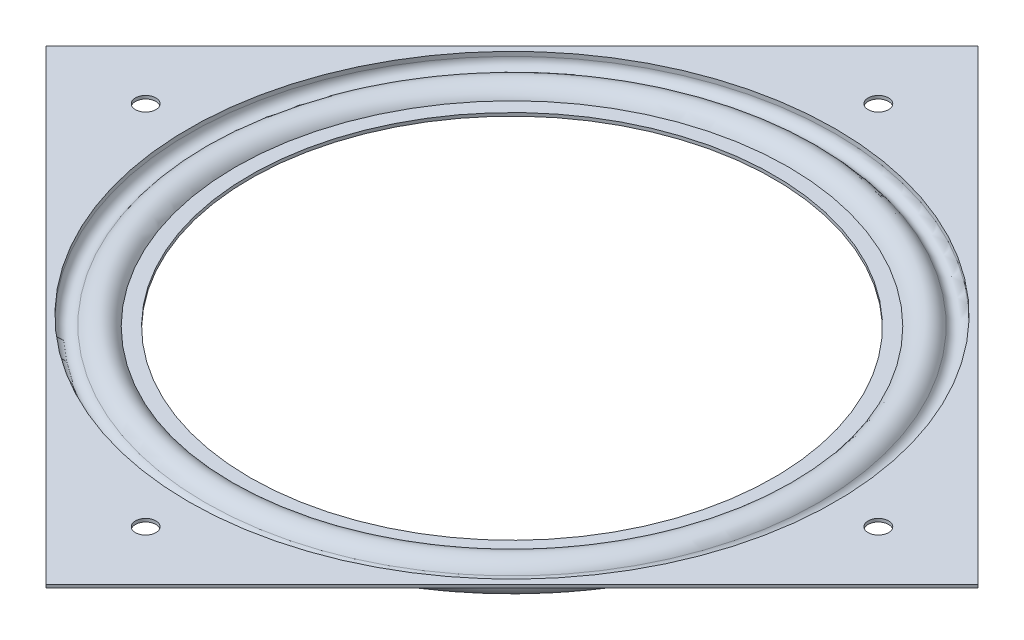
ISO-10303-21;
HEADER;
FILE_DESCRIPTION(('STEP AP214'),'2;1');
FILE_NAME('part.step','',(''),(''),'','','');
FILE_SCHEMA(('AUTOMOTIVE_DESIGN { 1 0 10303 214 1 1 1 1 }'));
ENDSEC;
DATA;
#1=APPLICATION_CONTEXT('core data for automotive mechanical design processes');
#2=APPLICATION_PROTOCOL_DEFINITION('international standard','automotive_design',2000,#1);
#3=PRODUCT_CONTEXT('',#1,'mechanical');
#4=PRODUCT('Part','Part','',(#3));
#5=PRODUCT_RELATED_PRODUCT_CATEGORY('part','',(#4));
#6=PRODUCT_DEFINITION_FORMATION('','',#4);
#7=PRODUCT_DEFINITION_CONTEXT('part definition',#1,'design');
#8=PRODUCT_DEFINITION('design','',#6,#7);
#9=PRODUCT_DEFINITION_SHAPE('','',#8);
#10=(LENGTH_UNIT() NAMED_UNIT(*) SI_UNIT(.MILLI.,.METRE.));
#11=(NAMED_UNIT(*) PLANE_ANGLE_UNIT() SI_UNIT($,.RADIAN.));
#12=(NAMED_UNIT(*) SI_UNIT($,.STERADIAN.) SOLID_ANGLE_UNIT());
#13=UNCERTAINTY_MEASURE_WITH_UNIT(LENGTH_MEASURE(1.E-05),#10,'distance_accuracy_value','');
#14=(GEOMETRIC_REPRESENTATION_CONTEXT(3) GLOBAL_UNCERTAINTY_ASSIGNED_CONTEXT((#13)) GLOBAL_UNIT_ASSIGNED_CONTEXT((#10,
#11,#12)) REPRESENTATION_CONTEXT('',''));
#15=CARTESIAN_POINT('',(0.,0.,0.));
#16=DIRECTION('',(0.,0.,1.));
#17=DIRECTION('',(1.,0.,0.));
#18=AXIS2_PLACEMENT_3D('',#15,#16,#17);
#19=CARTESIAN_POINT('',(34.1090250000007,-0.761999999999995,-59.0785642966366));
#20=DIRECTION('',(0.,1.,0.));
#21=DIRECTION('',(0.50000000000001,0.,-0.866025403784433));
#22=AXIS2_PLACEMENT_3D('',#19,#20,#21);
#23=SPHERICAL_SURFACE('',#22,3.27659999999999);
#24=CARTESIAN_POINT('',(34.1090250000007,2.5146,-59.0785642966366));
#25=VERTEX_POINT('',#24);
#26=VERTEX_LOOP('',#25);
#27=FACE_BOUND('',#26,.T.);
#28=ADVANCED_FACE('F41',(#27),#23,.T.);
#29=CLOSED_SHELL('',(#28));
#30=MANIFOLD_SOLID_BREP('B2',#29);
#31=CARTESIAN_POINT('',(-34.1090249999995,-0.761999999999995,-59.0785642966373));
#32=DIRECTION('',(0.,1.,0.));
#33=DIRECTION('',(-0.499999999999992,0.,-0.866025403784443));
#34=AXIS2_PLACEMENT_3D('',#31,#32,#33);
#35=SPHERICAL_SURFACE('',#34,3.27659999999999);
#36=CARTESIAN_POINT('',(-34.1090249999995,2.5146,-59.0785642966373));
#37=VERTEX_POINT('',#36);
#38=VERTEX_LOOP('',#37);
#39=FACE_BOUND('',#38,.T.);
#40=ADVANCED_FACE('F59',(#39),#35,.T.);
#41=CLOSED_SHELL('',(#40));
#42=MANIFOLD_SOLID_BREP('B6',#41);
#43=CARTESIAN_POINT('',(-68.21805,-0.761999999999995,-4.76364373004656E-13));
#44=DIRECTION('',(0.,1.,0.));
#45=DIRECTION('',(-1.,0.,0.));
#46=AXIS2_PLACEMENT_3D('',#43,#44,#45);
#47=SPHERICAL_SURFACE('',#46,3.27659999999999);
#48=CARTESIAN_POINT('',(-68.21805,2.5146,-4.76364373004656E-13));
#49=VERTEX_POINT('',#48);
#50=VERTEX_LOOP('',#49);
#51=FACE_BOUND('',#50,.T.);
#52=ADVANCED_FACE('F77',(#51),#47,.T.);
#53=CLOSED_SHELL('',(#52));
#54=MANIFOLD_SOLID_BREP('B37',#53);
#55=CARTESIAN_POINT('',(-34.1090250000003,-0.761999999999995,59.0785642966369));
#56=DIRECTION('',(0.,1.,0.));
#57=DIRECTION('',(-0.500000000000004,0.,0.866025403784436));
#58=AXIS2_PLACEMENT_3D('',#55,#56,#57);
#59=SPHERICAL_SURFACE('',#58,3.27659999999999);
#60=CARTESIAN_POINT('',(-34.1090250000003,2.5146,59.0785642966369));
#61=VERTEX_POINT('',#60);
#62=VERTEX_LOOP('',#61);
#63=FACE_BOUND('',#62,.T.);
#64=ADVANCED_FACE('F95',(#63),#59,.T.);
#65=CLOSED_SHELL('',(#64));
#66=MANIFOLD_SOLID_BREP('B55',#65);
#67=CARTESIAN_POINT('',(34.1090249999999,-0.761999999999995,59.0785642966371));
#68=DIRECTION('',(0.,1.,0.));
#69=DIRECTION('',(0.499999999999998,0.,0.86602540378444));
#70=AXIS2_PLACEMENT_3D('',#67,#68,#69);
#71=SPHERICAL_SURFACE('',#70,3.27659999999999);
#72=CARTESIAN_POINT('',(34.1090249999999,2.5146,59.0785642966371));
#73=VERTEX_POINT('',#72);
#74=VERTEX_LOOP('',#73);
#75=FACE_BOUND('',#74,.T.);
#76=ADVANCED_FACE('F113',(#75),#71,.T.);
#77=CLOSED_SHELL('',(#76));
#78=MANIFOLD_SOLID_BREP('B73',#77);
#79=CARTESIAN_POINT('',(68.21805,-0.761999999999995,0.));
#80=DIRECTION('',(0.,1.,0.));
#81=DIRECTION('',(1.,0.,0.));
#82=AXIS2_PLACEMENT_3D('',#79,#80,#81);
#83=SPHERICAL_SURFACE('',#82,3.27659999999999);
#84=CARTESIAN_POINT('',(68.21805,2.5146,0.));
#85=VERTEX_POINT('',#84);
#86=VERTEX_LOOP('',#85);
#87=FACE_BOUND('',#86,.T.);
#88=ADVANCED_FACE('F134',(#87),#83,.T.);
#89=CLOSED_SHELL('',(#88));
#90=MANIFOLD_SOLID_BREP('B91',#89);
#91=CARTESIAN_POINT('',(75.5293408614699,2.5654,0.));
#92=DIRECTION('',(0.,1.,0.));
#93=DIRECTION('',(0.,0.,1.));
#94=AXIS2_PLACEMENT_3D('',#91,#92,#93);
#95=PLANE('',#94);
#96=CARTESIAN_POINT('',(85.5998013460312,2.5654,0.));
#97=DIRECTION('',(0.,1.,0.));
#98=DIRECTION('',(0.,0.,1.));
#99=AXIS2_PLACEMENT_3D('',#96,#97,#98);
#100=CIRCLE('',#99,2.3876);
#101=CARTESIAN_POINT('',(85.5998013460312,2.5654,2.38760000000001));
#102=VERTEX_POINT('',#101);
#103=EDGE_CURVE('E261',#102,#102,#100,.T.);
#104=ORIENTED_EDGE('',*,*,#103,.T.);
#105=EDGE_LOOP('',(#104));
#106=FACE_BOUND('',#105,.T.);
#107=CARTESIAN_POINT('',(0.,2.5654,-85.5998013460312));
#108=DIRECTION('',(0.,1.,0.));
#109=DIRECTION('',(0.,0.,1.));
#110=AXIS2_PLACEMENT_3D('',#107,#108,#109);
#111=CIRCLE('',#110,2.3876);
#112=CARTESIAN_POINT('',(0.,2.5654,-83.2122013460312));
#113=VERTEX_POINT('',#112);
#114=EDGE_CURVE('E265',#113,#113,#111,.T.);
#115=ORIENTED_EDGE('',*,*,#114,.T.);
#116=EDGE_LOOP('',(#115));
#117=FACE_BOUND('',#116,.T.);
#118=CARTESIAN_POINT('',(-85.5998013460312,2.5654,0.));
#119=DIRECTION('',(0.,1.,0.));
#120=DIRECTION('',(0.,0.,1.));
#121=AXIS2_PLACEMENT_3D('',#118,#119,#120);
#122=CIRCLE('',#121,2.3876);
#123=CARTESIAN_POINT('',(-85.5998013460312,2.5654,2.3876));
#124=VERTEX_POINT('',#123);
#125=EDGE_CURVE('E269',#124,#124,#122,.T.);
#126=ORIENTED_EDGE('',*,*,#125,.T.);
#127=EDGE_LOOP('',(#126));
#128=FACE_BOUND('',#127,.T.);
#129=CARTESIAN_POINT('',(0.,2.5654,85.5998013460312));
#130=DIRECTION('',(0.,1.,0.));
#131=DIRECTION('',(0.,0.,1.));
#132=AXIS2_PLACEMENT_3D('',#129,#130,#131);
#133=CIRCLE('',#132,2.3876);
#134=CARTESIAN_POINT('',(0.,2.5654,87.9874013460312));
#135=VERTEX_POINT('',#134);
#136=EDGE_CURVE('E192',#135,#135,#133,.T.);
#137=ORIENTED_EDGE('',*,*,#136,.T.);
#138=EDGE_LOOP('',(#137));
#139=FACE_BOUND('',#138,.T.);
#140=DIRECTION('',(-0.707106781186548,0.,0.707106781186547));
#141=VECTOR('',#140,1.);
#142=CARTESIAN_POINT('',(108.894585724085,2.5654,0.));
#143=LINE('',#142,#141);
#144=CARTESIAN_POINT('',(108.894585724085,2.5654,0.));
#145=VERTEX_POINT('',#144);
#146=CARTESIAN_POINT('',(0.,2.5654,108.894585724085));
#147=VERTEX_POINT('',#146);
#148=EDGE_CURVE('E161',#145,#147,#143,.T.);
#149=ORIENTED_EDGE('',*,*,#148,.T.);
#150=DIRECTION('',(-0.707106781186547,0.,-0.707106781186548));
#151=VECTOR('',#150,1.);
#152=CARTESIAN_POINT('',(-108.894585724085,2.5654,0.));
#153=LINE('',#152,#151);
#154=CARTESIAN_POINT('',(-108.894585724085,2.5654,0.));
#155=VERTEX_POINT('',#154);
#156=EDGE_CURVE('E489',#147,#155,#153,.T.);
#157=ORIENTED_EDGE('',*,*,#156,.T.);
#158=DIRECTION('',(0.707106781186547,0.,-0.707106781186548));
#159=VECTOR('',#158,1.);
#160=CARTESIAN_POINT('',(0.,2.5654,-108.894585724085));
#161=LINE('',#160,#159);
#162=CARTESIAN_POINT('',(0.,2.5654,-108.894585724085));
#163=VERTEX_POINT('',#162);
#164=EDGE_CURVE('E217',#155,#163,#161,.T.);
#165=ORIENTED_EDGE('',*,*,#164,.T.);
#166=DIRECTION('',(0.707106781186548,0.,0.707106781186548));
#167=VECTOR('',#166,1.);
#168=CARTESIAN_POINT('',(0.,2.5654,-108.894585724085));
#169=LINE('',#168,#167);
#170=EDGE_CURVE('E206',#163,#145,#169,.T.);
#171=ORIENTED_EDGE('',*,*,#170,.T.);
#172=EDGE_LOOP('',(#149,#157,#165,#171));
#173=FACE_BOUND('',#172,.T.);
#174=CARTESIAN_POINT('',(0.,2.56540000000001,0.));
#175=DIRECTION('',(0.,1.,0.));
#176=DIRECTION('',(0.,0.,1.));
#177=AXIS2_PLACEMENT_3D('',#174,#175,#176);
#178=CIRCLE('',#177,76.26594086147);
#179=CARTESIAN_POINT('',(0.,2.56540000000001,76.26594086147));
#180=VERTEX_POINT('',#179);
#181=EDGE_CURVE('E213',#180,#180,#178,.T.);
#182=ORIENTED_EDGE('',*,*,#181,.T.);
#183=EDGE_LOOP('',(#182));
#184=FACE_BOUND('',#183,.T.);
#185=ADVANCED_FACE('F146',(#106,#117,#128,#139,#173,#184),#95,.F.);
#186=CARTESIAN_POINT('',(75.5293408614699,3.302,0.));
#187=DIRECTION('',(0.,1.,0.));
#188=DIRECTION('',(0.,0.,1.));
#189=AXIS2_PLACEMENT_3D('',#186,#187,#188);
#190=PLANE('',#189);
#191=CARTESIAN_POINT('',(85.5998013460312,3.302,0.));
#192=DIRECTION('',(0.,1.,0.));
#193=DIRECTION('',(0.,0.,1.));
#194=AXIS2_PLACEMENT_3D('',#191,#192,#193);
#195=CIRCLE('',#194,2.3876);
#196=CARTESIAN_POINT('',(85.5998013460312,3.302,2.38760000000001));
#197=VERTEX_POINT('',#196);
#198=EDGE_CURVE('E471',#197,#197,#195,.T.);
#199=ORIENTED_EDGE('',*,*,#198,.F.);
#200=EDGE_LOOP('',(#199));
#201=FACE_BOUND('',#200,.T.);
#202=CARTESIAN_POINT('',(0.,3.302,-85.5998013460312));
#203=DIRECTION('',(0.,1.,0.));
#204=DIRECTION('',(0.,0.,1.));
#205=AXIS2_PLACEMENT_3D('',#202,#203,#204);
#206=CIRCLE('',#205,2.3876);
#207=CARTESIAN_POINT('',(0.,3.302,-83.2122013460312));
#208=VERTEX_POINT('',#207);
#209=EDGE_CURVE('E472',#208,#208,#206,.T.);
#210=ORIENTED_EDGE('',*,*,#209,.F.);
#211=EDGE_LOOP('',(#210));
#212=FACE_BOUND('',#211,.T.);
#213=CARTESIAN_POINT('',(-85.5998013460312,3.302,0.));
#214=DIRECTION('',(0.,1.,0.));
#215=DIRECTION('',(0.,0.,1.));
#216=AXIS2_PLACEMENT_3D('',#213,#214,#215);
#217=CIRCLE('',#216,2.3876);
#218=CARTESIAN_POINT('',(-85.5998013460312,3.302,2.3876));
#219=VERTEX_POINT('',#218);
#220=EDGE_CURVE('E479',#219,#219,#217,.T.);
#221=ORIENTED_EDGE('',*,*,#220,.F.);
#222=EDGE_LOOP('',(#221));
#223=FACE_BOUND('',#222,.T.);
#224=CARTESIAN_POINT('',(0.,3.302,85.5998013460312));
#225=DIRECTION('',(0.,1.,0.));
#226=DIRECTION('',(0.,0.,1.));
#227=AXIS2_PLACEMENT_3D('',#224,#225,#226);
#228=CIRCLE('',#227,2.3876);
#229=CARTESIAN_POINT('',(0.,3.302,87.9874013460312));
#230=VERTEX_POINT('',#229);
#231=EDGE_CURVE('E483',#230,#230,#228,.T.);
#232=ORIENTED_EDGE('',*,*,#231,.F.);
#233=EDGE_LOOP('',(#232));
#234=FACE_BOUND('',#233,.T.);
#235=DIRECTION('',(-0.707106781186548,0.,-0.707106781186548));
#236=VECTOR('',#235,1.);
#237=CARTESIAN_POINT('',(0.,3.302,-108.894585724085));
#238=LINE('',#237,#236);
#239=CARTESIAN_POINT('',(108.894585724085,3.302,0.));
#240=VERTEX_POINT('',#239);
#241=CARTESIAN_POINT('',(0.,3.302,-108.894585724085));
#242=VERTEX_POINT('',#241);
#243=EDGE_CURVE('E180',#240,#242,#238,.T.);
#244=ORIENTED_EDGE('',*,*,#243,.T.);
#245=DIRECTION('',(-0.707106781186547,0.,0.707106781186548));
#246=VECTOR('',#245,1.);
#247=CARTESIAN_POINT('',(0.,3.302,-108.894585724085));
#248=LINE('',#247,#246);
#249=CARTESIAN_POINT('',(-108.894585724085,3.302,0.));
#250=VERTEX_POINT('',#249);
#251=EDGE_CURVE('E184',#242,#250,#248,.T.);
#252=ORIENTED_EDGE('',*,*,#251,.T.);
#253=DIRECTION('',(0.707106781186548,0.,0.707106781186548));
#254=VECTOR('',#253,1.);
#255=CARTESIAN_POINT('',(-108.894585724085,3.302,0.));
#256=LINE('',#255,#254);
#257=CARTESIAN_POINT('',(0.,3.302,108.894585724085));
#258=VERTEX_POINT('',#257);
#259=EDGE_CURVE('E202',#250,#258,#256,.T.);
#260=ORIENTED_EDGE('',*,*,#259,.T.);
#261=DIRECTION('',(0.707106781186548,0.,-0.707106781186547));
#262=VECTOR('',#261,1.);
#263=CARTESIAN_POINT('',(108.894585724085,3.302,0.));
#264=LINE('',#263,#262);
#265=EDGE_CURVE('E187',#258,#240,#264,.T.);
#266=ORIENTED_EDGE('',*,*,#265,.T.);
#267=EDGE_LOOP('',(#244,#252,#260,#266));
#268=FACE_BOUND('',#267,.T.);
#269=CARTESIAN_POINT('',(0.,3.30200000000001,0.));
#270=DIRECTION('',(0.,1.,0.));
#271=DIRECTION('',(0.,0.,1.));
#272=AXIS2_PLACEMENT_3D('',#269,#270,#271);
#273=CIRCLE('',#272,75.5293408614699);
#274=CARTESIAN_POINT('',(0.,3.30200000000001,75.5293408614699));
#275=VERTEX_POINT('',#274);
#276=EDGE_CURVE('E132',#275,#275,#273,.T.);
#277=ORIENTED_EDGE('',*,*,#276,.F.);
#278=EDGE_LOOP('',(#277));
#279=FACE_BOUND('',#278,.T.);
#280=ADVANCED_FACE('F182',(#201,#212,#223,#234,#268,#279),#190,.T.);
#281=CARTESIAN_POINT('',(0.,21.7127262600922,0.));
#282=DIRECTION('',(0.,1.,0.));
#283=DIRECTION('',(0.,0.,1.));
#284=AXIS2_PLACEMENT_3D('',#281,#282,#283);
#285=CYLINDRICAL_SURFACE('',#284,75.5293408614699);
#286=ORIENTED_EDGE('',*,*,#276,.T.);
#287=EDGE_LOOP('',(#286));
#288=FACE_BOUND('',#287,.T.);
#289=CARTESIAN_POINT('',(0.,2.28599999999999,0.));
#290=DIRECTION('',(0.,1.,0.));
#291=DIRECTION('',(0.,0.,1.));
#292=AXIS2_PLACEMENT_3D('',#289,#290,#291);
#293=CIRCLE('',#292,75.5293408614699);
#294=CARTESIAN_POINT('',(0.,2.28599999999999,75.5293408614699));
#295=VERTEX_POINT('',#294);
#296=EDGE_CURVE('E154',#295,#295,#293,.T.);
#297=ORIENTED_EDGE('',*,*,#296,.F.);
#298=EDGE_LOOP('',(#297));
#299=FACE_BOUND('',#298,.T.);
#300=ADVANCED_FACE('F243',(#288,#299),#285,.F.);
#301=CARTESIAN_POINT('',(0.,2.28599999999999,0.));
#302=DIRECTION('',(0.,1.,0.));
#303=DIRECTION('',(0.,0.,1.));
#304=AXIS2_PLACEMENT_3D('',#301,#302,#303);
#305=TOROIDAL_SURFACE('',#304,73.49734086147,2.032);
#306=ORIENTED_EDGE('',*,*,#296,.T.);
#307=EDGE_LOOP('',(#306));
#308=FACE_BOUND('',#307,.T.);
#309=CARTESIAN_POINT('',(0.,1.26999999999999,0.));
#310=DIRECTION('',(0.,1.,0.));
#311=DIRECTION('',(0.,0.,1.));
#312=AXIS2_PLACEMENT_3D('',#309,#310,#311);
#313=CIRCLE('',#312,71.73757724098);
#314=CARTESIAN_POINT('',(0.,1.26999999999999,71.73757724098));
#315=VERTEX_POINT('',#314);
#316=EDGE_CURVE('E235',#315,#315,#313,.T.);
#317=ORIENTED_EDGE('',*,*,#316,.F.);
#318=EDGE_LOOP('',(#317));
#319=FACE_BOUND('',#318,.T.);
#320=ADVANCED_FACE('F240',(#308,#319),#305,.F.);
#321=CARTESIAN_POINT('',(0.,-0.761999999999995,0.));
#322=DIRECTION('',(0.,1.,0.));
#323=DIRECTION('',(0.,0.,1.));
#324=AXIS2_PLACEMENT_3D('',#321,#322,#323);
#325=TOROIDAL_SURFACE('',#324,68.21805,4.064);
#326=ORIENTED_EDGE('',*,*,#316,.T.);
#327=EDGE_LOOP('',(#326));
#328=FACE_BOUND('',#327,.T.);
#329=CARTESIAN_POINT('',(0.,1.0414,0.));
#330=DIRECTION('',(0.,1.,0.));
#331=DIRECTION('',(0.,0.,1.));
#332=AXIS2_PLACEMENT_3D('',#329,#330,#331);
#333=CIRCLE('',#332,64.5760938717634);
#334=CARTESIAN_POINT('',(0.,1.0414,64.5760938717634));
#335=VERTEX_POINT('',#334);
#336=EDGE_CURVE('E232',#335,#335,#333,.T.);
#337=ORIENTED_EDGE('',*,*,#336,.F.);
#338=EDGE_LOOP('',(#337));
#339=FACE_BOUND('',#338,.T.);
#340=ADVANCED_FACE('F251',(#328,#339),#325,.T.);
#341=CARTESIAN_POINT('',(61.214,1.0414,0.));
#342=DIRECTION('',(0.,1.,0.));
#343=DIRECTION('',(0.,0.,1.));
#344=AXIS2_PLACEMENT_3D('',#341,#342,#343);
#345=PLANE('',#344);
#346=ORIENTED_EDGE('',*,*,#336,.T.);
#347=EDGE_LOOP('',(#346));
#348=FACE_BOUND('',#347,.T.);
#349=CARTESIAN_POINT('',(0.,1.0414,0.));
#350=DIRECTION('',(0.,1.,0.));
#351=DIRECTION('',(0.,0.,1.));
#352=AXIS2_PLACEMENT_3D('',#349,#350,#351);
#353=CIRCLE('',#352,61.214);
#354=CARTESIAN_POINT('',(0.,1.0414,61.214));
#355=VERTEX_POINT('',#354);
#356=EDGE_CURVE('E229',#355,#355,#353,.T.);
#357=ORIENTED_EDGE('',*,*,#356,.F.);
#358=EDGE_LOOP('',(#357));
#359=FACE_BOUND('',#358,.T.);
#360=ADVANCED_FACE('F301',(#348,#359),#345,.T.);
#361=CARTESIAN_POINT('',(0.,21.7127262600922,0.));
#362=DIRECTION('',(0.,1.,0.));
#363=DIRECTION('',(0.,0.,1.));
#364=AXIS2_PLACEMENT_3D('',#361,#362,#363);
#365=CYLINDRICAL_SURFACE('',#364,61.214);
#366=ORIENTED_EDGE('',*,*,#356,.T.);
#367=EDGE_LOOP('',(#366));
#368=FACE_BOUND('',#367,.T.);
#369=CARTESIAN_POINT('',(0.,0.304800000000001,0.));
#370=DIRECTION('',(0.,1.,0.));
#371=DIRECTION('',(0.,0.,1.));
#372=AXIS2_PLACEMENT_3D('',#369,#370,#371);
#373=CIRCLE('',#372,61.214);
#374=CARTESIAN_POINT('',(0.,0.304800000000001,61.214));
#375=VERTEX_POINT('',#374);
#376=EDGE_CURVE('E226',#375,#375,#373,.T.);
#377=ORIENTED_EDGE('',*,*,#376,.F.);
#378=EDGE_LOOP('',(#377));
#379=FACE_BOUND('',#378,.T.);
#380=ADVANCED_FACE('F296',(#368,#379),#365,.F.);
#381=CARTESIAN_POINT('',(61.214,0.304800000000002,0.));
#382=DIRECTION('',(0.,1.,0.));
#383=DIRECTION('',(0.,0.,1.));
#384=AXIS2_PLACEMENT_3D('',#381,#382,#383);
#385=PLANE('',#384);
#386=CARTESIAN_POINT('',(0.,0.304800000000001,0.));
#387=DIRECTION('',(0.,1.,0.));
#388=DIRECTION('',(0.,0.,1.));
#389=AXIS2_PLACEMENT_3D('',#386,#387,#388);
#390=CIRCLE('',#389,65.0662999274213);
#391=CARTESIAN_POINT('',(0.,0.304800000000001,65.0662999274213));
#392=VERTEX_POINT('',#391);
#393=EDGE_CURVE('E223',#392,#392,#390,.T.);
#394=ORIENTED_EDGE('',*,*,#393,.F.);
#395=EDGE_LOOP('',(#394));
#396=FACE_BOUND('',#395,.T.);
#397=ORIENTED_EDGE('',*,*,#376,.T.);
#398=EDGE_LOOP('',(#397));
#399=FACE_BOUND('',#398,.T.);
#400=ADVANCED_FACE('F290',(#396,#399),#385,.F.);
#401=CARTESIAN_POINT('',(0.,-0.761999999999995,0.));
#402=DIRECTION('',(0.,1.,0.));
#403=DIRECTION('',(0.,0.,1.));
#404=AXIS2_PLACEMENT_3D('',#401,#402,#403);
#405=TOROIDAL_SURFACE('',#404,68.21805,3.3274);
#406=CARTESIAN_POINT('',(0.,0.901699999999995,0.));
#407=DIRECTION('',(0.,1.,0.));
#408=DIRECTION('',(0.,0.,1.));
#409=AXIS2_PLACEMENT_3D('',#406,#407,#408);
#410=CIRCLE('',#409,71.0996629285523);
#411=CARTESIAN_POINT('',(0.,0.901699999999995,71.0996629285523));
#412=VERTEX_POINT('',#411);
#413=EDGE_CURVE('E220',#412,#412,#410,.T.);
#414=ORIENTED_EDGE('',*,*,#413,.F.);
#415=EDGE_LOOP('',(#414));
#416=FACE_BOUND('',#415,.T.);
#417=ORIENTED_EDGE('',*,*,#393,.T.);
#418=EDGE_LOOP('',(#417));
#419=FACE_BOUND('',#418,.T.);
#420=ADVANCED_FACE('F284',(#416,#419),#405,.F.);
#421=CARTESIAN_POINT('',(0.,2.28599999999999,0.));
#422=DIRECTION('',(0.,1.,0.));
#423=DIRECTION('',(0.,0.,1.));
#424=AXIS2_PLACEMENT_3D('',#421,#422,#423);
#425=TOROIDAL_SURFACE('',#424,73.49734086147,2.7686);
#426=CARTESIAN_POINT('',(0.,2.28599999999999,0.));
#427=DIRECTION('',(0.,1.,0.));
#428=DIRECTION('',(0.,0.,1.));
#429=AXIS2_PLACEMENT_3D('',#426,#427,#428);
#430=CIRCLE('',#429,76.26594086147);
#431=CARTESIAN_POINT('',(0.,2.28599999999999,76.26594086147));
#432=VERTEX_POINT('',#431);
#433=EDGE_CURVE('E216',#432,#432,#430,.T.);
#434=ORIENTED_EDGE('',*,*,#433,.F.);
#435=EDGE_LOOP('',(#434));
#436=FACE_BOUND('',#435,.T.);
#437=ORIENTED_EDGE('',*,*,#413,.T.);
#438=EDGE_LOOP('',(#437));
#439=FACE_BOUND('',#438,.T.);
#440=ADVANCED_FACE('F278',(#436,#439),#425,.T.);
#441=CARTESIAN_POINT('',(0.,21.7127262600922,0.));
#442=DIRECTION('',(0.,1.,0.));
#443=DIRECTION('',(0.,0.,1.));
#444=AXIS2_PLACEMENT_3D('',#441,#442,#443);
#445=CYLINDRICAL_SURFACE('',#444,76.26594086147);
#446=ORIENTED_EDGE('',*,*,#181,.F.);
#447=EDGE_LOOP('',(#446));
#448=FACE_BOUND('',#447,.T.);
#449=ORIENTED_EDGE('',*,*,#433,.T.);
#450=EDGE_LOOP('',(#449));
#451=FACE_BOUND('',#450,.T.);
#452=ADVANCED_FACE('F275',(#448,#451),#445,.T.);
#453=CARTESIAN_POINT('',(0.,-305.435,-108.894585724085));
#454=DIRECTION('',(-0.707106781186548,0.,-0.707106781186547));
#455=DIRECTION('',(-0.707106781186547,0.,0.707106781186548));
#456=AXIS2_PLACEMENT_3D('',#453,#454,#455);
#457=PLANE('',#456);
#458=DIRECTION('',(0.,1.,0.));
#459=VECTOR('',#458,1.);
#460=CARTESIAN_POINT('',(0.,-305.435,-108.894585724085));
#461=LINE('',#460,#459);
#462=EDGE_CURVE('E198',#163,#242,#461,.T.);
#463=ORIENTED_EDGE('',*,*,#462,.F.);
#464=ORIENTED_EDGE('',*,*,#164,.F.);
#465=DIRECTION('',(0.,1.,0.));
#466=VECTOR('',#465,1.);
#467=CARTESIAN_POINT('',(-108.894585724085,-305.435,0.));
#468=LINE('',#467,#466);
#469=EDGE_CURVE('E200',#155,#250,#468,.T.);
#470=ORIENTED_EDGE('',*,*,#469,.T.);
#471=ORIENTED_EDGE('',*,*,#251,.F.);
#472=EDGE_LOOP('',(#463,#464,#470,#471));
#473=FACE_BOUND('',#472,.T.);
#474=ADVANCED_FACE('F196',(#473),#457,.T.);
#475=CARTESIAN_POINT('',(-108.894585724085,-305.435,0.));
#476=DIRECTION('',(-0.707106781186548,0.,0.707106781186547));
#477=DIRECTION('',(0.707106781186547,0.,0.707106781186548));
#478=AXIS2_PLACEMENT_3D('',#475,#476,#477);
#479=PLANE('',#478);
#480=ORIENTED_EDGE('',*,*,#156,.F.);
#481=DIRECTION('',(0.,1.,0.));
#482=VECTOR('',#481,1.);
#483=CARTESIAN_POINT('',(0.,-305.435,108.894585724085));
#484=LINE('',#483,#482);
#485=EDGE_CURVE('E208',#147,#258,#484,.T.);
#486=ORIENTED_EDGE('',*,*,#485,.T.);
#487=ORIENTED_EDGE('',*,*,#259,.F.);
#488=ORIENTED_EDGE('',*,*,#469,.F.);
#489=EDGE_LOOP('',(#480,#486,#487,#488));
#490=FACE_BOUND('',#489,.T.);
#491=ADVANCED_FACE('F355',(#490),#479,.T.);
#492=CARTESIAN_POINT('',(108.894585724085,-305.435,0.));
#493=DIRECTION('',(0.707106781186547,0.,0.707106781186548));
#494=DIRECTION('',(0.707106781186548,0.,-0.707106781186547));
#495=AXIS2_PLACEMENT_3D('',#492,#493,#494);
#496=PLANE('',#495);
#497=ORIENTED_EDGE('',*,*,#485,.F.);
#498=ORIENTED_EDGE('',*,*,#148,.F.);
#499=DIRECTION('',(0.,1.,0.));
#500=VECTOR('',#499,1.);
#501=CARTESIAN_POINT('',(108.894585724085,-305.435,0.));
#502=LINE('',#501,#500);
#503=EDGE_CURVE('E491',#145,#240,#502,.T.);
#504=ORIENTED_EDGE('',*,*,#503,.T.);
#505=ORIENTED_EDGE('',*,*,#265,.F.);
#506=EDGE_LOOP('',(#497,#498,#504,#505));
#507=FACE_BOUND('',#506,.T.);
#508=ADVANCED_FACE('F362',(#507),#496,.T.);
#509=CARTESIAN_POINT('',(0.,-305.435,-108.894585724085));
#510=DIRECTION('',(0.707106781186548,0.,-0.707106781186548));
#511=DIRECTION('',(-0.707106781186548,0.,-0.707106781186548));
#512=AXIS2_PLACEMENT_3D('',#509,#510,#511);
#513=PLANE('',#512);
#514=ORIENTED_EDGE('',*,*,#503,.F.);
#515=ORIENTED_EDGE('',*,*,#170,.F.);
#516=ORIENTED_EDGE('',*,*,#462,.T.);
#517=ORIENTED_EDGE('',*,*,#243,.F.);
#518=EDGE_LOOP('',(#514,#515,#516,#517));
#519=FACE_BOUND('',#518,.T.);
#520=ADVANCED_FACE('F205',(#519),#513,.T.);
#521=CARTESIAN_POINT('',(0.,3.302,85.5998013460312));
#522=DIRECTION('',(0.,1.,0.));
#523=DIRECTION('',(0.,0.,1.));
#524=AXIS2_PLACEMENT_3D('',#521,#522,#523);
#525=CYLINDRICAL_SURFACE('',#524,2.3876);
#526=ORIENTED_EDGE('',*,*,#231,.T.);
#527=EDGE_LOOP('',(#526));
#528=FACE_BOUND('',#527,.T.);
#529=ORIENTED_EDGE('',*,*,#136,.F.);
#530=EDGE_LOOP('',(#529));
#531=FACE_BOUND('',#530,.T.);
#532=ADVANCED_FACE('F377',(#528,#531),#525,.F.);
#533=CARTESIAN_POINT('',(-85.5998013460312,3.302,0.));
#534=DIRECTION('',(0.,1.,0.));
#535=DIRECTION('',(0.,0.,1.));
#536=AXIS2_PLACEMENT_3D('',#533,#534,#535);
#537=CYLINDRICAL_SURFACE('',#536,2.3876);
#538=ORIENTED_EDGE('',*,*,#220,.T.);
#539=EDGE_LOOP('',(#538));
#540=FACE_BOUND('',#539,.T.);
#541=ORIENTED_EDGE('',*,*,#125,.F.);
#542=EDGE_LOOP('',(#541));
#543=FACE_BOUND('',#542,.T.);
#544=ADVANCED_FACE('F384',(#540,#543),#537,.F.);
#545=CARTESIAN_POINT('',(0.,3.302,-85.5998013460312));
#546=DIRECTION('',(0.,1.,0.));
#547=DIRECTION('',(0.,0.,1.));
#548=AXIS2_PLACEMENT_3D('',#545,#546,#547);
#549=CYLINDRICAL_SURFACE('',#548,2.3876);
#550=ORIENTED_EDGE('',*,*,#209,.T.);
#551=EDGE_LOOP('',(#550));
#552=FACE_BOUND('',#551,.T.);
#553=ORIENTED_EDGE('',*,*,#114,.F.);
#554=EDGE_LOOP('',(#553));
#555=FACE_BOUND('',#554,.T.);
#556=ADVANCED_FACE('F393',(#552,#555),#549,.F.);
#557=CARTESIAN_POINT('',(85.5998013460312,3.302,0.));
#558=DIRECTION('',(0.,1.,0.));
#559=DIRECTION('',(0.,0.,1.));
#560=AXIS2_PLACEMENT_3D('',#557,#558,#559);
#561=CYLINDRICAL_SURFACE('',#560,2.3876);
#562=ORIENTED_EDGE('',*,*,#198,.T.);
#563=EDGE_LOOP('',(#562));
#564=FACE_BOUND('',#563,.T.);
#565=ORIENTED_EDGE('',*,*,#103,.F.);
#566=EDGE_LOOP('',(#565));
#567=FACE_BOUND('',#566,.T.);
#568=ADVANCED_FACE('F401',(#564,#567),#561,.F.);
#569=CLOSED_SHELL('',(#185,#280,#300,#320,#340,#360,#380,#400,#420,#440,#452,#474,#491,#508,
#520,#532,#544,#556,#568));
#570=MANIFOLD_SOLID_BREP('B109',#569);
#571=ADVANCED_BREP_SHAPE_REPRESENTATION('',(#18,#30,#42,#54,#66,#78,#90,#570),#14);
#572=SHAPE_DEFINITION_REPRESENTATION(#9,#571);
ENDSEC;
END-ISO-10303-21;
